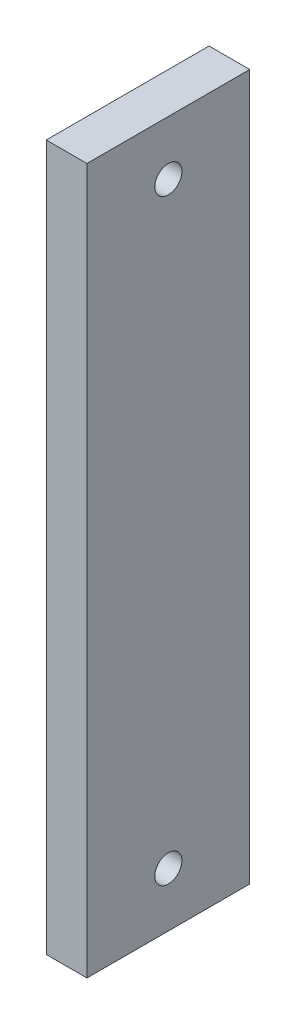
ISO-10303-21;
HEADER;
FILE_DESCRIPTION(('STEP AP214'),'2;1');
FILE_NAME('part.step','',(''),(''),'','','');
FILE_SCHEMA(('AUTOMOTIVE_DESIGN { 1 0 10303 214 1 1 1 1 }'));
ENDSEC;
DATA;
#1=APPLICATION_CONTEXT('core data for automotive mechanical design processes');
#2=APPLICATION_PROTOCOL_DEFINITION('international standard','automotive_design',2000,#1);
#3=PRODUCT_CONTEXT('',#1,'mechanical');
#4=PRODUCT('Part','Part','',(#3));
#5=PRODUCT_RELATED_PRODUCT_CATEGORY('part','',(#4));
#6=PRODUCT_DEFINITION_FORMATION('','',#4);
#7=PRODUCT_DEFINITION_CONTEXT('part definition',#1,'design');
#8=PRODUCT_DEFINITION('design','',#6,#7);
#9=PRODUCT_DEFINITION_SHAPE('','',#8);
#10=(LENGTH_UNIT() NAMED_UNIT(*) SI_UNIT(.MILLI.,.METRE.));
#11=(NAMED_UNIT(*) PLANE_ANGLE_UNIT() SI_UNIT($,.RADIAN.));
#12=(NAMED_UNIT(*) SI_UNIT($,.STERADIAN.) SOLID_ANGLE_UNIT());
#13=UNCERTAINTY_MEASURE_WITH_UNIT(LENGTH_MEASURE(1.E-05),#10,'distance_accuracy_value','');
#14=(GEOMETRIC_REPRESENTATION_CONTEXT(3) GLOBAL_UNCERTAINTY_ASSIGNED_CONTEXT((#13)) GLOBAL_UNIT_ASSIGNED_CONTEXT((#10,
#11,#12)) REPRESENTATION_CONTEXT('',''));
#15=CARTESIAN_POINT('',(0.,0.,0.));
#16=DIRECTION('',(0.,0.,1.));
#17=DIRECTION('',(1.,0.,0.));
#18=AXIS2_PLACEMENT_3D('',#15,#16,#17);
#19=CARTESIAN_POINT('',(-4.7625,165.1,-19.05));
#20=DIRECTION('',(1.,0.,0.));
#21=DIRECTION('',(0.,0.,-1.));
#22=AXIS2_PLACEMENT_3D('',#19,#20,#21);
#23=PLANE('',#22);
#24=CARTESIAN_POINT('',(-4.7625,12.7,0.));
#25=DIRECTION('',(1.,0.,0.));
#26=DIRECTION('',(0.,0.,-1.));
#27=AXIS2_PLACEMENT_3D('',#24,#25,#26);
#28=CIRCLE('',#27,3.175);
#29=CARTESIAN_POINT('',(-4.7625,12.7,-3.175));
#30=VERTEX_POINT('',#29);
#31=EDGE_CURVE('E117',#30,#30,#28,.T.);
#32=ORIENTED_EDGE('',*,*,#31,.T.);
#33=EDGE_LOOP('',(#32));
#34=FACE_BOUND('',#33,.T.);
#35=CARTESIAN_POINT('',(-4.7625,152.4,0.));
#36=DIRECTION('',(1.,0.,0.));
#37=DIRECTION('',(0.,0.,-1.));
#38=AXIS2_PLACEMENT_3D('',#35,#36,#37);
#39=CIRCLE('',#38,3.175);
#40=CARTESIAN_POINT('',(-4.7625,152.4,-3.175));
#41=VERTEX_POINT('',#40);
#42=EDGE_CURVE('E101',#41,#41,#39,.T.);
#43=ORIENTED_EDGE('',*,*,#42,.T.);
#44=EDGE_LOOP('',(#43));
#45=FACE_BOUND('',#44,.T.);
#46=DIRECTION('',(0.,0.,1.));
#47=VECTOR('',#46,1.);
#48=CARTESIAN_POINT('',(-4.7625,0.,-19.05));
#49=LINE('',#48,#47);
#50=CARTESIAN_POINT('',(-4.7625,0.,-19.05));
#51=VERTEX_POINT('',#50);
#52=CARTESIAN_POINT('',(-4.7625,0.,19.05));
#53=VERTEX_POINT('',#52);
#54=EDGE_CURVE('E98',#51,#53,#49,.T.);
#55=ORIENTED_EDGE('',*,*,#54,.T.);
#56=DIRECTION('',(0.,-1.,0.));
#57=VECTOR('',#56,1.);
#58=CARTESIAN_POINT('',(-4.7625,165.1,19.05));
#59=LINE('',#58,#57);
#60=CARTESIAN_POINT('',(-4.7625,165.1,19.05));
#61=VERTEX_POINT('',#60);
#62=EDGE_CURVE('E11',#61,#53,#59,.T.);
#63=ORIENTED_EDGE('',*,*,#62,.F.);
#64=DIRECTION('',(0.,0.,1.));
#65=VECTOR('',#64,1.);
#66=CARTESIAN_POINT('',(-4.7625,165.1,-19.05));
#67=LINE('',#66,#65);
#68=CARTESIAN_POINT('',(-4.7625,165.1,-19.05));
#69=VERTEX_POINT('',#68);
#70=EDGE_CURVE('E86',#69,#61,#67,.T.);
#71=ORIENTED_EDGE('',*,*,#70,.F.);
#72=DIRECTION('',(0.,-1.,0.));
#73=VECTOR('',#72,1.);
#74=CARTESIAN_POINT('',(-4.7625,165.1,-19.05));
#75=LINE('',#74,#73);
#76=EDGE_CURVE('E94',#69,#51,#75,.T.);
#77=ORIENTED_EDGE('',*,*,#76,.T.);
#78=EDGE_LOOP('',(#55,#63,#71,#77));
#79=FACE_BOUND('',#78,.T.);
#80=ADVANCED_FACE('F35',(#34,#45,#79),#23,.F.);
#81=CARTESIAN_POINT('',(4.7625,165.1,19.05));
#82=DIRECTION('',(0.,0.,-1.));
#83=DIRECTION('',(-1.,0.,0.));
#84=AXIS2_PLACEMENT_3D('',#81,#82,#83);
#85=PLANE('',#84);
#86=DIRECTION('',(1.,0.,0.));
#87=VECTOR('',#86,1.);
#88=CARTESIAN_POINT('',(4.7625,0.,19.05));
#89=LINE('',#88,#87);
#90=CARTESIAN_POINT('',(4.7625,0.,19.05));
#91=VERTEX_POINT('',#90);
#92=EDGE_CURVE('E90',#53,#91,#89,.T.);
#93=ORIENTED_EDGE('',*,*,#92,.T.);
#94=DIRECTION('',(0.,-1.,0.));
#95=VECTOR('',#94,1.);
#96=CARTESIAN_POINT('',(4.7625,165.1,19.05));
#97=LINE('',#96,#95);
#98=CARTESIAN_POINT('',(4.7625,165.1,19.05));
#99=VERTEX_POINT('',#98);
#100=EDGE_CURVE('E43',#99,#91,#97,.T.);
#101=ORIENTED_EDGE('',*,*,#100,.F.);
#102=DIRECTION('',(1.,0.,0.));
#103=VECTOR('',#102,1.);
#104=CARTESIAN_POINT('',(4.7625,165.1,19.05));
#105=LINE('',#104,#103);
#106=EDGE_CURVE('E81',#61,#99,#105,.T.);
#107=ORIENTED_EDGE('',*,*,#106,.F.);
#108=ORIENTED_EDGE('',*,*,#62,.T.);
#109=EDGE_LOOP('',(#93,#101,#107,#108));
#110=FACE_BOUND('',#109,.T.);
#111=ADVANCED_FACE('F89',(#110),#85,.F.);
#112=CARTESIAN_POINT('',(4.7625,165.1,-19.05));
#113=DIRECTION('',(-1.,0.,0.));
#114=DIRECTION('',(0.,0.,1.));
#115=AXIS2_PLACEMENT_3D('',#112,#113,#114);
#116=PLANE('',#115);
#117=CARTESIAN_POINT('',(4.7625,12.7,0.));
#118=DIRECTION('',(1.,0.,0.));
#119=DIRECTION('',(0.,0.,-1.));
#120=AXIS2_PLACEMENT_3D('',#117,#118,#119);
#121=CIRCLE('',#120,3.175);
#122=CARTESIAN_POINT('',(4.7625,12.7,-3.175));
#123=VERTEX_POINT('',#122);
#124=EDGE_CURVE('E120',#123,#123,#121,.T.);
#125=ORIENTED_EDGE('',*,*,#124,.F.);
#126=EDGE_LOOP('',(#125));
#127=FACE_BOUND('',#126,.T.);
#128=CARTESIAN_POINT('',(4.7625,152.4,0.));
#129=DIRECTION('',(1.,0.,0.));
#130=DIRECTION('',(0.,0.,-1.));
#131=AXIS2_PLACEMENT_3D('',#128,#129,#130);
#132=CIRCLE('',#131,3.175);
#133=CARTESIAN_POINT('',(4.7625,152.4,-3.175));
#134=VERTEX_POINT('',#133);
#135=EDGE_CURVE('E114',#134,#134,#132,.T.);
#136=ORIENTED_EDGE('',*,*,#135,.F.);
#137=EDGE_LOOP('',(#136));
#138=FACE_BOUND('',#137,.T.);
#139=DIRECTION('',(0.,0.,-1.));
#140=VECTOR('',#139,1.);
#141=CARTESIAN_POINT('',(4.7625,0.,-19.05));
#142=LINE('',#141,#140);
#143=CARTESIAN_POINT('',(4.7625,0.,-19.05));
#144=VERTEX_POINT('',#143);
#145=EDGE_CURVE('E68',#91,#144,#142,.T.);
#146=ORIENTED_EDGE('',*,*,#145,.T.);
#147=DIRECTION('',(0.,-1.,0.));
#148=VECTOR('',#147,1.);
#149=CARTESIAN_POINT('',(4.7625,165.1,-19.05));
#150=LINE('',#149,#148);
#151=CARTESIAN_POINT('',(4.7625,165.1,-19.05));
#152=VERTEX_POINT('',#151);
#153=EDGE_CURVE('E91',#152,#144,#150,.T.);
#154=ORIENTED_EDGE('',*,*,#153,.F.);
#155=DIRECTION('',(0.,0.,-1.));
#156=VECTOR('',#155,1.);
#157=CARTESIAN_POINT('',(4.7625,165.1,-19.05));
#158=LINE('',#157,#156);
#159=EDGE_CURVE('E84',#99,#152,#158,.T.);
#160=ORIENTED_EDGE('',*,*,#159,.F.);
#161=ORIENTED_EDGE('',*,*,#100,.T.);
#162=EDGE_LOOP('',(#146,#154,#160,#161));
#163=FACE_BOUND('',#162,.T.);
#164=ADVANCED_FACE('F92',(#127,#138,#163),#116,.F.);
#165=CARTESIAN_POINT('',(4.7625,165.1,-19.05));
#166=DIRECTION('',(0.,0.,1.));
#167=DIRECTION('',(1.,0.,0.));
#168=AXIS2_PLACEMENT_3D('',#165,#166,#167);
#169=PLANE('',#168);
#170=DIRECTION('',(-1.,0.,0.));
#171=VECTOR('',#170,1.);
#172=CARTESIAN_POINT('',(4.7625,0.,-19.05));
#173=LINE('',#172,#171);
#174=EDGE_CURVE('E74',#144,#51,#173,.T.);
#175=ORIENTED_EDGE('',*,*,#174,.T.);
#176=ORIENTED_EDGE('',*,*,#76,.F.);
#177=DIRECTION('',(-1.,0.,0.));
#178=VECTOR('',#177,1.);
#179=CARTESIAN_POINT('',(4.7625,165.1,-19.05));
#180=LINE('',#179,#178);
#181=EDGE_CURVE('E51',#152,#69,#180,.T.);
#182=ORIENTED_EDGE('',*,*,#181,.F.);
#183=ORIENTED_EDGE('',*,*,#153,.T.);
#184=EDGE_LOOP('',(#175,#176,#182,#183));
#185=FACE_BOUND('',#184,.T.);
#186=ADVANCED_FACE('F106',(#185),#169,.F.);
#187=CARTESIAN_POINT('',(0.,165.1,0.));
#188=DIRECTION('',(0.,-1.,0.));
#189=DIRECTION('',(0.,0.,-1.));
#190=AXIS2_PLACEMENT_3D('',#187,#188,#189);
#191=PLANE('',#190);
#192=ORIENTED_EDGE('',*,*,#70,.T.);
#193=ORIENTED_EDGE('',*,*,#106,.T.);
#194=ORIENTED_EDGE('',*,*,#159,.T.);
#195=ORIENTED_EDGE('',*,*,#181,.T.);
#196=EDGE_LOOP('',(#192,#193,#194,#195));
#197=FACE_BOUND('',#196,.T.);
#198=ADVANCED_FACE('F82',(#197),#191,.F.);
#199=CARTESIAN_POINT('',(0.,0.,0.));
#200=DIRECTION('',(0.,-1.,0.));
#201=DIRECTION('',(0.,0.,-1.));
#202=AXIS2_PLACEMENT_3D('',#199,#200,#201);
#203=PLANE('',#202);
#204=ORIENTED_EDGE('',*,*,#54,.F.);
#205=ORIENTED_EDGE('',*,*,#174,.F.);
#206=ORIENTED_EDGE('',*,*,#145,.F.);
#207=ORIENTED_EDGE('',*,*,#92,.F.);
#208=EDGE_LOOP('',(#204,#205,#206,#207));
#209=FACE_BOUND('',#208,.T.);
#210=ADVANCED_FACE('F109',(#209),#203,.T.);
#211=CARTESIAN_POINT('',(-96.8375,152.4,0.));
#212=DIRECTION('',(1.,0.,0.));
#213=DIRECTION('',(0.,0.,-1.));
#214=AXIS2_PLACEMENT_3D('',#211,#212,#213);
#215=CYLINDRICAL_SURFACE('',#214,3.175);
#216=ORIENTED_EDGE('',*,*,#135,.T.);
#217=EDGE_LOOP('',(#216));
#218=FACE_BOUND('',#217,.T.);
#219=ORIENTED_EDGE('',*,*,#42,.F.);
#220=EDGE_LOOP('',(#219));
#221=FACE_BOUND('',#220,.T.);
#222=ADVANCED_FACE('F132',(#218,#221),#215,.F.);
#223=CARTESIAN_POINT('',(-96.8375,12.7,0.));
#224=DIRECTION('',(1.,0.,0.));
#225=DIRECTION('',(0.,0.,-1.));
#226=AXIS2_PLACEMENT_3D('',#223,#224,#225);
#227=CYLINDRICAL_SURFACE('',#226,3.175);
#228=ORIENTED_EDGE('',*,*,#124,.T.);
#229=EDGE_LOOP('',(#228));
#230=FACE_BOUND('',#229,.T.);
#231=ORIENTED_EDGE('',*,*,#31,.F.);
#232=EDGE_LOOP('',(#231));
#233=FACE_BOUND('',#232,.T.);
#234=ADVANCED_FACE('F124',(#230,#233),#227,.F.);
#235=CLOSED_SHELL('',(#80,#111,#164,#186,#198,#210,#222,#234));
#236=MANIFOLD_SOLID_BREP('B2',#235);
#237=ADVANCED_BREP_SHAPE_REPRESENTATION('',(#18,#236),#14);
#238=SHAPE_DEFINITION_REPRESENTATION(#9,#237);
ENDSEC;
END-ISO-10303-21;
